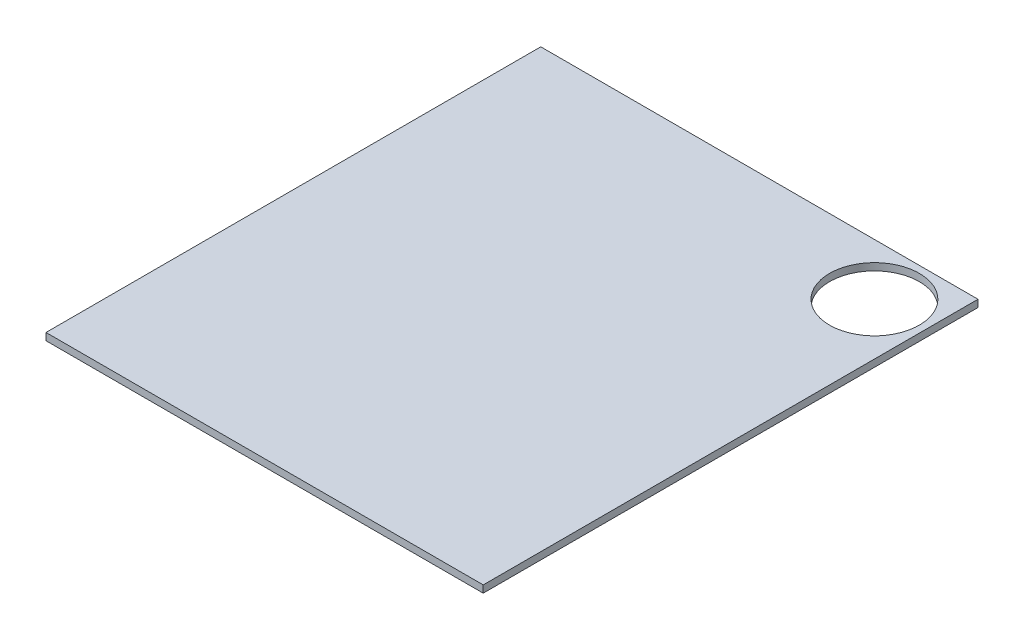
ISO-10303-21;
HEADER;
FILE_DESCRIPTION(('STEP AP214'),'2;1');
FILE_NAME('part.step','',(''),(''),'','','');
FILE_SCHEMA(('AUTOMOTIVE_DESIGN { 1 0 10303 214 1 1 1 1 }'));
ENDSEC;
DATA;
#1=APPLICATION_CONTEXT('core data for automotive mechanical design processes');
#2=APPLICATION_PROTOCOL_DEFINITION('international standard','automotive_design',2000,#1);
#3=PRODUCT_CONTEXT('',#1,'mechanical');
#4=PRODUCT('Part','Part','',(#3));
#5=PRODUCT_RELATED_PRODUCT_CATEGORY('part','',(#4));
#6=PRODUCT_DEFINITION_FORMATION('','',#4);
#7=PRODUCT_DEFINITION_CONTEXT('part definition',#1,'design');
#8=PRODUCT_DEFINITION('design','',#6,#7);
#9=PRODUCT_DEFINITION_SHAPE('','',#8);
#10=(LENGTH_UNIT() NAMED_UNIT(*) SI_UNIT(.MILLI.,.METRE.));
#11=(NAMED_UNIT(*) PLANE_ANGLE_UNIT() SI_UNIT($,.RADIAN.));
#12=(NAMED_UNIT(*) SI_UNIT($,.STERADIAN.) SOLID_ANGLE_UNIT());
#13=UNCERTAINTY_MEASURE_WITH_UNIT(LENGTH_MEASURE(1.E-05),#10,'distance_accuracy_value','');
#14=(GEOMETRIC_REPRESENTATION_CONTEXT(3) GLOBAL_UNCERTAINTY_ASSIGNED_CONTEXT((#13)) GLOBAL_UNIT_ASSIGNED_CONTEXT((#10,
#11,#12)) REPRESENTATION_CONTEXT('',''));
#15=CARTESIAN_POINT('',(0.,0.,0.));
#16=DIRECTION('',(0.,0.,1.));
#17=DIRECTION('',(1.,0.,0.));
#18=AXIS2_PLACEMENT_3D('',#15,#16,#17);
#19=CARTESIAN_POINT('',(190.,6.25,0.));
#20=DIRECTION('',(-1.,0.,0.));
#21=DIRECTION('',(0.,0.,1.));
#22=AXIS2_PLACEMENT_3D('',#19,#20,#21);
#23=PLANE('',#22);
#24=DIRECTION('',(0.,0.,-1.));
#25=VECTOR('',#24,1.);
#26=CARTESIAN_POINT('',(190.,0.,0.));
#27=LINE('',#26,#25);
#28=CARTESIAN_POINT('',(190.,0.,215.));
#29=VERTEX_POINT('',#28);
#30=CARTESIAN_POINT('',(190.,0.,-215.));
#31=VERTEX_POINT('',#30);
#32=EDGE_CURVE('E103',#29,#31,#27,.T.);
#33=ORIENTED_EDGE('',*,*,#32,.T.);
#34=DIRECTION('',(0.,-1.,0.));
#35=VECTOR('',#34,1.);
#36=CARTESIAN_POINT('',(190.,6.25,-215.));
#37=LINE('',#36,#35);
#38=CARTESIAN_POINT('',(190.,6.25,-215.));
#39=VERTEX_POINT('',#38);
#40=EDGE_CURVE('E11',#39,#31,#37,.T.);
#41=ORIENTED_EDGE('',*,*,#40,.F.);
#42=DIRECTION('',(0.,0.,-1.));
#43=VECTOR('',#42,1.);
#44=CARTESIAN_POINT('',(190.,6.25,0.));
#45=LINE('',#44,#43);
#46=CARTESIAN_POINT('',(190.,6.25,215.));
#47=VERTEX_POINT('',#46);
#48=EDGE_CURVE('E76',#47,#39,#45,.T.);
#49=ORIENTED_EDGE('',*,*,#48,.F.);
#50=DIRECTION('',(0.,-1.,0.));
#51=VECTOR('',#50,1.);
#52=CARTESIAN_POINT('',(190.,6.25,215.));
#53=LINE('',#52,#51);
#54=EDGE_CURVE('E102',#47,#29,#53,.T.);
#55=ORIENTED_EDGE('',*,*,#54,.T.);
#56=EDGE_LOOP('',(#33,#41,#49,#55));
#57=FACE_BOUND('',#56,.T.);
#58=ADVANCED_FACE('F37',(#57),#23,.F.);
#59=CARTESIAN_POINT('',(0.,6.25,-215.));
#60=DIRECTION('',(0.,0.,-1.));
#61=DIRECTION('',(-1.,0.,0.));
#62=AXIS2_PLACEMENT_3D('',#59,#60,#61);
#63=PLANE('',#62);
#64=DIRECTION('',(1.,0.,0.));
#65=VECTOR('',#64,1.);
#66=CARTESIAN_POINT('',(0.,0.,-215.));
#67=LINE('',#66,#65);
#68=CARTESIAN_POINT('',(-190.,0.,-215.));
#69=VERTEX_POINT('',#68);
#70=EDGE_CURVE('E85',#69,#31,#67,.T.);
#71=ORIENTED_EDGE('',*,*,#70,.F.);
#72=DIRECTION('',(0.,-1.,0.));
#73=VECTOR('',#72,1.);
#74=CARTESIAN_POINT('',(-190.,6.25,-215.));
#75=LINE('',#74,#73);
#76=CARTESIAN_POINT('',(-190.,6.25,-215.));
#77=VERTEX_POINT('',#76);
#78=EDGE_CURVE('E45',#77,#69,#75,.T.);
#79=ORIENTED_EDGE('',*,*,#78,.F.);
#80=DIRECTION('',(1.,0.,0.));
#81=VECTOR('',#80,1.);
#82=CARTESIAN_POINT('',(0.,6.25,-215.));
#83=LINE('',#82,#81);
#84=EDGE_CURVE('E83',#77,#39,#83,.T.);
#85=ORIENTED_EDGE('',*,*,#84,.T.);
#86=ORIENTED_EDGE('',*,*,#40,.T.);
#87=EDGE_LOOP('',(#71,#79,#85,#86));
#88=FACE_BOUND('',#87,.T.);
#89=ADVANCED_FACE('F82',(#88),#63,.T.);
#90=CARTESIAN_POINT('',(-190.,6.25,0.));
#91=DIRECTION('',(-1.,0.,0.));
#92=DIRECTION('',(0.,0.,1.));
#93=AXIS2_PLACEMENT_3D('',#90,#91,#92);
#94=PLANE('',#93);
#95=DIRECTION('',(0.,0.,-1.));
#96=VECTOR('',#95,1.);
#97=CARTESIAN_POINT('',(-190.,0.,0.));
#98=LINE('',#97,#96);
#99=CARTESIAN_POINT('',(-190.,0.,215.));
#100=VERTEX_POINT('',#99);
#101=EDGE_CURVE('E107',#100,#69,#98,.T.);
#102=ORIENTED_EDGE('',*,*,#101,.F.);
#103=DIRECTION('',(0.,-1.,0.));
#104=VECTOR('',#103,1.);
#105=CARTESIAN_POINT('',(-190.,6.25,215.));
#106=LINE('',#105,#104);
#107=CARTESIAN_POINT('',(-190.,6.25,215.));
#108=VERTEX_POINT('',#107);
#109=EDGE_CURVE('E68',#108,#100,#106,.T.);
#110=ORIENTED_EDGE('',*,*,#109,.F.);
#111=DIRECTION('',(0.,0.,-1.));
#112=VECTOR('',#111,1.);
#113=CARTESIAN_POINT('',(-190.,6.25,0.));
#114=LINE('',#113,#112);
#115=EDGE_CURVE('E92',#108,#77,#114,.T.);
#116=ORIENTED_EDGE('',*,*,#115,.T.);
#117=ORIENTED_EDGE('',*,*,#78,.T.);
#118=EDGE_LOOP('',(#102,#110,#116,#117));
#119=FACE_BOUND('',#118,.T.);
#120=ADVANCED_FACE('F94',(#119),#94,.T.);
#121=CARTESIAN_POINT('',(0.,6.25,215.));
#122=DIRECTION('',(0.,0.,-1.));
#123=DIRECTION('',(-1.,0.,0.));
#124=AXIS2_PLACEMENT_3D('',#121,#122,#123);
#125=PLANE('',#124);
#126=DIRECTION('',(1.,0.,0.));
#127=VECTOR('',#126,1.);
#128=CARTESIAN_POINT('',(0.,0.,215.));
#129=LINE('',#128,#127);
#130=EDGE_CURVE('E71',#100,#29,#129,.T.);
#131=ORIENTED_EDGE('',*,*,#130,.T.);
#132=ORIENTED_EDGE('',*,*,#54,.F.);
#133=DIRECTION('',(1.,0.,0.));
#134=VECTOR('',#133,1.);
#135=CARTESIAN_POINT('',(0.,6.25,215.));
#136=LINE('',#135,#134);
#137=EDGE_CURVE('E53',#108,#47,#136,.T.);
#138=ORIENTED_EDGE('',*,*,#137,.F.);
#139=ORIENTED_EDGE('',*,*,#109,.T.);
#140=EDGE_LOOP('',(#131,#132,#138,#139));
#141=FACE_BOUND('',#140,.T.);
#142=ADVANCED_FACE('F125',(#141),#125,.F.);
#143=CARTESIAN_POINT('',(145.,6.25,-170.));
#144=DIRECTION('',(0.,-1.,0.));
#145=DIRECTION('',(0.,0.,-1.));
#146=AXIS2_PLACEMENT_3D('',#143,#144,#145);
#147=CYLINDRICAL_SURFACE('',#146,39.);
#148=CARTESIAN_POINT('',(145.,6.25,-170.));
#149=DIRECTION('',(0.,1.,0.));
#150=DIRECTION('',(0.,0.,1.));
#151=AXIS2_PLACEMENT_3D('',#148,#149,#150);
#152=CIRCLE('',#151,39.);
#153=CARTESIAN_POINT('',(145.,6.25,-131.));
#154=VERTEX_POINT('',#153);
#155=EDGE_CURVE('E96',#154,#154,#152,.T.);
#156=ORIENTED_EDGE('',*,*,#155,.T.);
#157=EDGE_LOOP('',(#156));
#158=FACE_BOUND('',#157,.T.);
#159=CARTESIAN_POINT('',(145.,0.,-170.));
#160=DIRECTION('',(0.,1.,0.));
#161=DIRECTION('',(0.,0.,1.));
#162=AXIS2_PLACEMENT_3D('',#159,#160,#161);
#163=CIRCLE('',#162,39.);
#164=CARTESIAN_POINT('',(145.,0.,-131.));
#165=VERTEX_POINT('',#164);
#166=EDGE_CURVE('E110',#165,#165,#163,.T.);
#167=ORIENTED_EDGE('',*,*,#166,.F.);
#168=EDGE_LOOP('',(#167));
#169=FACE_BOUND('',#168,.T.);
#170=ADVANCED_FACE('F123',(#158,#169),#147,.F.);
#171=CARTESIAN_POINT('',(0.,6.25,0.));
#172=DIRECTION('',(0.,1.,0.));
#173=DIRECTION('',(0.,0.,1.));
#174=AXIS2_PLACEMENT_3D('',#171,#172,#173);
#175=PLANE('',#174);
#176=ORIENTED_EDGE('',*,*,#48,.T.);
#177=ORIENTED_EDGE('',*,*,#84,.F.);
#178=ORIENTED_EDGE('',*,*,#115,.F.);
#179=ORIENTED_EDGE('',*,*,#137,.T.);
#180=EDGE_LOOP('',(#176,#177,#178,#179));
#181=FACE_BOUND('',#180,.T.);
#182=ORIENTED_EDGE('',*,*,#155,.F.);
#183=EDGE_LOOP('',(#182));
#184=FACE_BOUND('',#183,.T.);
#185=ADVANCED_FACE('F90',(#181,#184),#175,.T.);
#186=CARTESIAN_POINT('',(0.,0.,0.));
#187=DIRECTION('',(0.,1.,0.));
#188=DIRECTION('',(0.,0.,1.));
#189=AXIS2_PLACEMENT_3D('',#186,#187,#188);
#190=PLANE('',#189);
#191=ORIENTED_EDGE('',*,*,#32,.F.);
#192=ORIENTED_EDGE('',*,*,#130,.F.);
#193=ORIENTED_EDGE('',*,*,#101,.T.);
#194=ORIENTED_EDGE('',*,*,#70,.T.);
#195=EDGE_LOOP('',(#191,#192,#193,#194));
#196=FACE_BOUND('',#195,.T.);
#197=ORIENTED_EDGE('',*,*,#166,.T.);
#198=EDGE_LOOP('',(#197));
#199=FACE_BOUND('',#198,.T.);
#200=ADVANCED_FACE('F117',(#196,#199),#190,.F.);
#201=CLOSED_SHELL('',(#58,#89,#120,#142,#170,#185,#200));
#202=MANIFOLD_SOLID_BREP('B2',#201);
#203=ADVANCED_BREP_SHAPE_REPRESENTATION('',(#18,#202),#14);
#204=SHAPE_DEFINITION_REPRESENTATION(#9,#203);
ENDSEC;
END-ISO-10303-21;
